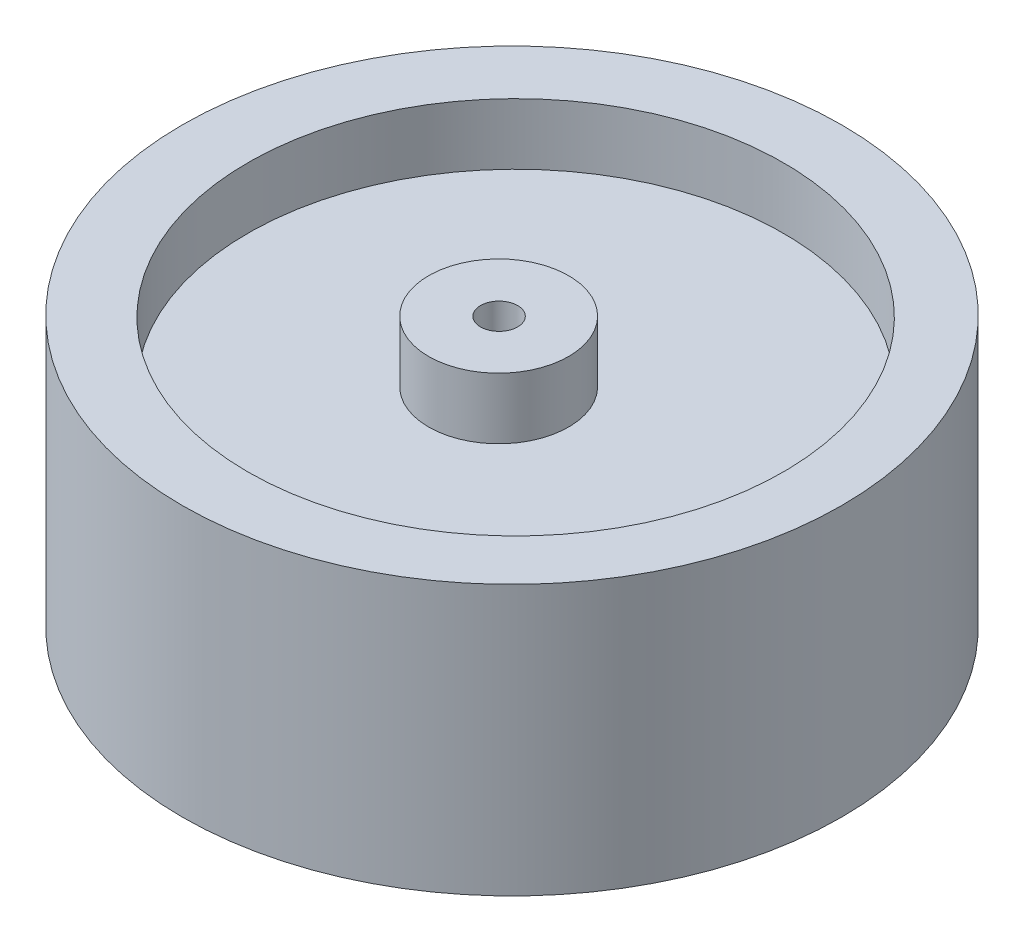
ISO-10303-21;
HEADER;
FILE_DESCRIPTION(('STEP AP214'),'2;1');
FILE_NAME('part.step','',(''),(''),'','','');
FILE_SCHEMA(('AUTOMOTIVE_DESIGN { 1 0 10303 214 1 1 1 1 }'));
ENDSEC;
DATA;
#1=APPLICATION_CONTEXT('core data for automotive mechanical design processes');
#2=APPLICATION_PROTOCOL_DEFINITION('international standard','automotive_design',2000,#1);
#3=PRODUCT_CONTEXT('',#1,'mechanical');
#4=PRODUCT('Part','Part','',(#3));
#5=PRODUCT_RELATED_PRODUCT_CATEGORY('part','',(#4));
#6=PRODUCT_DEFINITION_FORMATION('','',#4);
#7=PRODUCT_DEFINITION_CONTEXT('part definition',#1,'design');
#8=PRODUCT_DEFINITION('design','',#6,#7);
#9=PRODUCT_DEFINITION_SHAPE('','',#8);
#10=(LENGTH_UNIT() NAMED_UNIT(*) SI_UNIT(.MILLI.,.METRE.));
#11=(NAMED_UNIT(*) PLANE_ANGLE_UNIT() SI_UNIT($,.RADIAN.));
#12=(NAMED_UNIT(*) SI_UNIT($,.STERADIAN.) SOLID_ANGLE_UNIT());
#13=UNCERTAINTY_MEASURE_WITH_UNIT(LENGTH_MEASURE(1.E-05),#10,'distance_accuracy_value','');
#14=(GEOMETRIC_REPRESENTATION_CONTEXT(3) GLOBAL_UNCERTAINTY_ASSIGNED_CONTEXT((#13)) GLOBAL_UNIT_ASSIGNED_CONTEXT((#10,
#11,#12)) REPRESENTATION_CONTEXT('',''));
#15=CARTESIAN_POINT('',(0.,0.,0.));
#16=DIRECTION('',(0.,0.,1.));
#17=DIRECTION('',(1.,0.,0.));
#18=AXIS2_PLACEMENT_3D('',#15,#16,#17);
#19=CARTESIAN_POINT('',(3.18945115916419,26.6,0.));
#20=DIRECTION('',(0.,-1.,0.));
#21=DIRECTION('',(0.,0.,-1.));
#22=AXIS2_PLACEMENT_3D('',#19,#20,#21);
#23=CYLINDRICAL_SURFACE('',#22,32.5);
#24=CARTESIAN_POINT('',(3.18945115916419,26.6,0.));
#25=DIRECTION('',(0.,1.,0.));
#26=DIRECTION('',(0.,0.,1.));
#27=AXIS2_PLACEMENT_3D('',#24,#25,#26);
#28=CIRCLE('',#27,32.5);
#29=CARTESIAN_POINT('',(3.18945115916419,26.6,32.5));
#30=VERTEX_POINT('',#29);
#31=EDGE_CURVE('E51',#30,#30,#28,.T.);
#32=ORIENTED_EDGE('',*,*,#31,.F.);
#33=EDGE_LOOP('',(#32));
#34=FACE_BOUND('',#33,.T.);
#35=CARTESIAN_POINT('',(3.18945115916419,0.,0.));
#36=DIRECTION('',(0.,1.,0.));
#37=DIRECTION('',(0.,0.,1.));
#38=AXIS2_PLACEMENT_3D('',#35,#36,#37);
#39=CIRCLE('',#38,32.5);
#40=CARTESIAN_POINT('',(3.18945115916419,0.,32.5));
#41=VERTEX_POINT('',#40);
#42=EDGE_CURVE('E69',#41,#41,#39,.T.);
#43=ORIENTED_EDGE('',*,*,#42,.T.);
#44=EDGE_LOOP('',(#43));
#45=FACE_BOUND('',#44,.T.);
#46=ADVANCED_FACE('F37',(#34,#45),#23,.T.);
#47=CARTESIAN_POINT('',(3.18945115916419,26.6,0.));
#48=DIRECTION('',(0.,1.,0.));
#49=DIRECTION('',(0.,0.,1.));
#50=AXIS2_PLACEMENT_3D('',#47,#48,#49);
#51=PLANE('',#50);
#52=CARTESIAN_POINT('',(3.54785672823534,26.6,0.));
#53=DIRECTION('',(0.,1.,0.));
#54=DIRECTION('',(0.,0.,1.));
#55=AXIS2_PLACEMENT_3D('',#52,#53,#54);
#56=CIRCLE('',#55,26.4);
#57=CARTESIAN_POINT('',(3.54785672823534,26.6,26.4));
#58=VERTEX_POINT('',#57);
#59=EDGE_CURVE('E60',#58,#58,#56,.T.);
#60=ORIENTED_EDGE('',*,*,#59,.F.);
#61=EDGE_LOOP('',(#60));
#62=FACE_BOUND('',#61,.T.);
#63=ORIENTED_EDGE('',*,*,#31,.T.);
#64=EDGE_LOOP('',(#63));
#65=FACE_BOUND('',#64,.T.);
#66=ADVANCED_FACE('F84',(#62,#65),#51,.T.);
#67=CARTESIAN_POINT('',(3.18945115916419,0.,0.));
#68=DIRECTION('',(0.,1.,0.));
#69=DIRECTION('',(0.,0.,1.));
#70=AXIS2_PLACEMENT_3D('',#67,#68,#69);
#71=PLANE('',#70);
#72=CARTESIAN_POINT('',(2.92064698236082,0.,0.));
#73=DIRECTION('',(0.,-1.,0.));
#74=DIRECTION('',(0.,0.,-1.));
#75=AXIS2_PLACEMENT_3D('',#72,#73,#74);
#76=CIRCLE('',#75,25.9);
#77=CARTESIAN_POINT('',(2.92064698236082,0.,-25.9));
#78=VERTEX_POINT('',#77);
#79=EDGE_CURVE('E61',#78,#78,#76,.T.);
#80=ORIENTED_EDGE('',*,*,#79,.F.);
#81=EDGE_LOOP('',(#80));
#82=FACE_BOUND('',#81,.T.);
#83=ORIENTED_EDGE('',*,*,#42,.F.);
#84=EDGE_LOOP('',(#83));
#85=FACE_BOUND('',#84,.T.);
#86=ADVANCED_FACE('F81',(#82,#85),#71,.F.);
#87=CARTESIAN_POINT('',(3.54785672823534,20.574,0.));
#88=DIRECTION('',(0.,1.,0.));
#89=DIRECTION('',(0.,0.,1.));
#90=AXIS2_PLACEMENT_3D('',#87,#88,#89);
#91=CYLINDRICAL_SURFACE('',#90,26.4);
#92=CARTESIAN_POINT('',(3.54785672823534,20.574,0.));
#93=DIRECTION('',(0.,1.,0.));
#94=DIRECTION('',(0.,0.,1.));
#95=AXIS2_PLACEMENT_3D('',#92,#93,#94);
#96=CIRCLE('',#95,26.4);
#97=CARTESIAN_POINT('',(3.54785672823534,20.574,26.4));
#98=VERTEX_POINT('',#97);
#99=EDGE_CURVE('E65',#98,#98,#96,.T.);
#100=CARTESIAN_POINT('',(3.54785672823534,20.574,26.4));
#101=CARTESIAN_POINT('',(3.54785672823534,20.6367708333333,26.4));
#102=CARTESIAN_POINT('',(3.54785672823534,20.6995416666667,26.4));
#103=CARTESIAN_POINT('',(3.54785672823534,20.8250833333333,26.4));
#104=CARTESIAN_POINT('',(3.54785672823534,20.8878541666667,26.4));
#105=CARTESIAN_POINT('',(3.54785672823534,21.0133958333333,26.4));
#106=CARTESIAN_POINT('',(3.54785672823534,21.0761666666667,26.4));
#107=CARTESIAN_POINT('',(3.54785672823534,21.2017083333333,26.4));
#108=CARTESIAN_POINT('',(3.54785672823534,21.2644791666667,26.4));
#109=CARTESIAN_POINT('',(3.54785672823534,21.3900208333333,26.4));
#110=CARTESIAN_POINT('',(3.54785672823534,21.4527916666667,26.4));
#111=CARTESIAN_POINT('',(3.54785672823534,21.5783333333333,26.4));
#112=CARTESIAN_POINT('',(3.54785672823534,21.6411041666667,26.4));
#113=CARTESIAN_POINT('',(3.54785672823534,21.7666458333333,26.4));
#114=CARTESIAN_POINT('',(3.54785672823534,21.8294166666667,26.4));
#115=CARTESIAN_POINT('',(3.54785672823534,21.9549583333333,26.4));
#116=CARTESIAN_POINT('',(3.54785672823534,22.0177291666667,26.4));
#117=CARTESIAN_POINT('',(3.54785672823534,22.1432708333333,26.4));
#118=CARTESIAN_POINT('',(3.54785672823534,22.2060416666667,26.4));
#119=CARTESIAN_POINT('',(3.54785672823534,22.3315833333333,26.4));
#120=CARTESIAN_POINT('',(3.54785672823534,22.3943541666667,26.4));
#121=CARTESIAN_POINT('',(3.54785672823534,22.5198958333333,26.4));
#122=CARTESIAN_POINT('',(3.54785672823534,22.5826666666667,26.4));
#123=CARTESIAN_POINT('',(3.54785672823534,22.7082083333333,26.4));
#124=CARTESIAN_POINT('',(3.54785672823534,22.7709791666667,26.4));
#125=CARTESIAN_POINT('',(3.54785672823534,22.8965208333333,26.4));
#126=CARTESIAN_POINT('',(3.54785672823534,22.9592916666667,26.4));
#127=CARTESIAN_POINT('',(3.54785672823534,23.0848333333333,26.4));
#128=CARTESIAN_POINT('',(3.54785672823534,23.1476041666667,26.4));
#129=CARTESIAN_POINT('',(3.54785672823534,23.2731458333333,26.4));
#130=CARTESIAN_POINT('',(3.54785672823534,23.3359166666667,26.4));
#131=CARTESIAN_POINT('',(3.54785672823534,23.4614583333333,26.4));
#132=CARTESIAN_POINT('',(3.54785672823534,23.5242291666667,26.4));
#133=CARTESIAN_POINT('',(3.54785672823534,23.6497708333333,26.4));
#134=CARTESIAN_POINT('',(3.54785672823534,23.7125416666667,26.4));
#135=CARTESIAN_POINT('',(3.54785672823534,23.8380833333333,26.4));
#136=CARTESIAN_POINT('',(3.54785672823534,23.9008541666667,26.4));
#137=CARTESIAN_POINT('',(3.54785672823534,24.0263958333333,26.4));
#138=CARTESIAN_POINT('',(3.54785672823534,24.0891666666667,26.4));
#139=CARTESIAN_POINT('',(3.54785672823534,24.2147083333333,26.4));
#140=CARTESIAN_POINT('',(3.54785672823534,24.2774791666667,26.4));
#141=CARTESIAN_POINT('',(3.54785672823534,24.4030208333333,26.4));
#142=CARTESIAN_POINT('',(3.54785672823534,24.4657916666667,26.4));
#143=CARTESIAN_POINT('',(3.54785672823534,24.5913333333333,26.4));
#144=CARTESIAN_POINT('',(3.54785672823534,24.6541041666667,26.4));
#145=CARTESIAN_POINT('',(3.54785672823534,24.7796458333333,26.4));
#146=CARTESIAN_POINT('',(3.54785672823534,24.8424166666667,26.4));
#147=CARTESIAN_POINT('',(3.54785672823534,24.9679583333333,26.4));
#148=CARTESIAN_POINT('',(3.54785672823534,25.0307291666667,26.4));
#149=CARTESIAN_POINT('',(3.54785672823534,25.1562708333333,26.4));
#150=CARTESIAN_POINT('',(3.54785672823534,25.2190416666667,26.4));
#151=CARTESIAN_POINT('',(3.54785672823534,25.3445833333333,26.4));
#152=CARTESIAN_POINT('',(3.54785672823534,25.4073541666667,26.4));
#153=CARTESIAN_POINT('',(3.54785672823534,25.5328958333333,26.4));
#154=CARTESIAN_POINT('',(3.54785672823534,25.5956666666667,26.4));
#155=CARTESIAN_POINT('',(3.54785672823534,25.7212083333333,26.4));
#156=CARTESIAN_POINT('',(3.54785672823534,25.7839791666667,26.4));
#157=CARTESIAN_POINT('',(3.54785672823534,25.9095208333333,26.4));
#158=CARTESIAN_POINT('',(3.54785672823534,25.9722916666667,26.4));
#159=CARTESIAN_POINT('',(3.54785672823534,26.0978333333333,26.4));
#160=CARTESIAN_POINT('',(3.54785672823534,26.1606041666667,26.4));
#161=CARTESIAN_POINT('',(3.54785672823534,26.2861458333333,26.4));
#162=CARTESIAN_POINT('',(3.54785672823534,26.3489166666667,26.4));
#163=CARTESIAN_POINT('',(3.54785672823534,26.4744583333333,26.4));
#164=CARTESIAN_POINT('',(3.54785672823534,26.5372291666667,26.4));
#165=CARTESIAN_POINT('',(3.54785672823534,26.6,26.4));
#166=B_SPLINE_CURVE_WITH_KNOTS('',3,(#100,#101,#102,#103,#104,#105,#106,#107,#108,#109,#110,
#111,#112,#113,#114,#115,#116,#117,#118,#119,#120,#121,#122,#123,#124,#125,#126,#127,#128,#129,
#130,#131,#132,#133,#134,#135,#136,#137,#138,#139,#140,#141,#142,#143,#144,#145,#146,#147,#148,
#149,#150,#151,#152,#153,#154,#155,#156,#157,#158,#159,#160,#161,#162,#163,#164,#165),
.UNSPECIFIED.,.F.,.F.,(4,2,2,2,2,2,2,2,2,2,2,2,2,2,2,2,2,2,2,2,2,2,2,2,2,2,2,2,2,2,2,2,4),(0.,
0.188312499999999,0.376624999999998,0.564937499999998,0.753249999999997,0.941562499999996,
1.129875,1.31818749999999,1.5065,1.6948125,1.883125,2.0714375,2.25974999999999,2.44806249999999,
2.63637499999999,2.8246875,3.013,3.20131249999999,3.38962499999999,3.57793749999999,
3.76624999999999,3.95456249999999,4.14287499999999,4.33118749999999,4.51949999999999,
4.70781249999999,4.89612499999999,5.08443749999999,5.27274999999999,5.46106249999999,
5.64937499999999,5.83768749999999,6.02599999999999),.UNSPECIFIED.);
#167=EDGE_CURVE('BSEAM83',#98,#58,#166,.T.);
#168=ORIENTED_EDGE('',*,*,#99,.F.);
#169=ORIENTED_EDGE('',*,*,#59,.T.);
#170=ORIENTED_EDGE('',*,*,#167,.T.);
#171=ORIENTED_EDGE('',*,*,#167,.F.);
#172=EDGE_LOOP('',(#168,#170,#169,#171));
#173=FACE_BOUND('',#172,.T.);
#174=ADVANCED_FACE('F83',(#173),#91,.F.);
#175=CARTESIAN_POINT('',(3.54785672823534,20.574,0.));
#176=DIRECTION('',(0.,1.,0.));
#177=DIRECTION('',(0.,0.,1.));
#178=AXIS2_PLACEMENT_3D('',#175,#176,#177);
#179=PLANE('',#178);
#180=CARTESIAN_POINT('',(2.60515848770743,20.574,0.732268173699043));
#181=DIRECTION('',(0.,1.,0.));
#182=DIRECTION('',(0.,0.,1.));
#183=AXIS2_PLACEMENT_3D('',#180,#181,#182);
#184=CIRCLE('',#183,6.9);
#185=CARTESIAN_POINT('',(2.60515848770743,20.574,7.63226817369904));
#186=VERTEX_POINT('',#185);
#187=EDGE_CURVE('E10',#186,#186,#184,.T.);
#188=ORIENTED_EDGE('',*,*,#187,.F.);
#189=EDGE_LOOP('',(#188));
#190=FACE_BOUND('',#189,.T.);
#191=ORIENTED_EDGE('',*,*,#99,.T.);
#192=EDGE_LOOP('',(#191));
#193=FACE_BOUND('',#192,.T.);
#194=ADVANCED_FACE('F90',(#190,#193),#179,.T.);
#195=CARTESIAN_POINT('',(2.92064698236082,15.932,0.));
#196=DIRECTION('',(0.,-1.,0.));
#197=DIRECTION('',(0.,0.,-1.));
#198=AXIS2_PLACEMENT_3D('',#195,#196,#197);
#199=CYLINDRICAL_SURFACE('',#198,25.9);
#200=CARTESIAN_POINT('',(2.92064698236082,15.932,0.));
#201=DIRECTION('',(0.,-1.,0.));
#202=DIRECTION('',(0.,0.,-1.));
#203=AXIS2_PLACEMENT_3D('',#200,#201,#202);
#204=CIRCLE('',#203,25.9);
#205=CARTESIAN_POINT('',(2.92064698236082,15.932,-25.9));
#206=VERTEX_POINT('',#205);
#207=EDGE_CURVE('E56',#206,#206,#204,.T.);
#208=ORIENTED_EDGE('',*,*,#207,.F.);
#209=EDGE_LOOP('',(#208));
#210=FACE_BOUND('',#209,.T.);
#211=ORIENTED_EDGE('',*,*,#79,.T.);
#212=EDGE_LOOP('',(#211));
#213=FACE_BOUND('',#212,.T.);
#214=ADVANCED_FACE('F123',(#210,#213),#199,.F.);
#215=CARTESIAN_POINT('',(2.92064698236082,15.932,0.));
#216=DIRECTION('',(0.,-1.,0.));
#217=DIRECTION('',(0.,0.,-1.));
#218=AXIS2_PLACEMENT_3D('',#215,#216,#217);
#219=PLANE('',#218);
#220=CARTESIAN_POINT('',(2.60515848770743,15.932,0.732268173699043));
#221=DIRECTION('',(0.,-1.,0.));
#222=DIRECTION('',(0.,0.,-1.));
#223=AXIS2_PLACEMENT_3D('',#220,#221,#222);
#224=CIRCLE('',#223,6.9);
#225=CARTESIAN_POINT('',(2.60515848770743,15.932,7.63226817369904));
#226=VERTEX_POINT('',#225);
#227=EDGE_CURVE('E45',#226,#226,#224,.T.);
#228=ORIENTED_EDGE('',*,*,#227,.F.);
#229=EDGE_LOOP('',(#228));
#230=FACE_BOUND('',#229,.T.);
#231=ORIENTED_EDGE('',*,*,#207,.T.);
#232=EDGE_LOOP('',(#231));
#233=FACE_BOUND('',#232,.T.);
#234=ADVANCED_FACE('F128',(#230,#233),#219,.T.);
#235=CARTESIAN_POINT('',(2.60515848770743,-0.254000000000004,0.732268173699043));
#236=DIRECTION('',(0.,1.,0.));
#237=DIRECTION('',(0.,0.,1.));
#238=AXIS2_PLACEMENT_3D('',#235,#236,#237);
#239=PLANE('',#238);
#240=CARTESIAN_POINT('',(2.64141744815092,-0.254000000000004,0.724168536309739));
#241=DIRECTION('',(0.,1.,0.));
#242=DIRECTION('',(0.,0.,1.));
#243=AXIS2_PLACEMENT_3D('',#240,#241,#242);
#244=CIRCLE('',#243,1.83);
#245=CARTESIAN_POINT('',(2.64141744815092,-0.254000000000004,2.55416853630974));
#246=VERTEX_POINT('',#245);
#247=EDGE_CURVE('E202',#246,#246,#244,.F.);
#248=ORIENTED_EDGE('',*,*,#247,.F.);
#249=EDGE_LOOP('',(#248));
#250=FACE_BOUND('',#249,.T.);
#251=CARTESIAN_POINT('',(2.60515848770743,-0.254000000000004,0.732268173699043));
#252=DIRECTION('',(0.,1.,0.));
#253=DIRECTION('',(0.,0.,1.));
#254=AXIS2_PLACEMENT_3D('',#251,#252,#253);
#255=CIRCLE('',#254,6.9);
#256=CARTESIAN_POINT('',(2.60515848770743,-0.254000000000004,7.63226817369904));
#257=VERTEX_POINT('',#256);
#258=EDGE_CURVE('E54',#257,#257,#255,.T.);
#259=ORIENTED_EDGE('',*,*,#258,.F.);
#260=EDGE_LOOP('',(#259));
#261=FACE_BOUND('',#260,.T.);
#262=ADVANCED_FACE('F145',(#250,#261),#239,.F.);
#263=CARTESIAN_POINT('',(2.60515848770743,-0.254000000000004,0.732268173699043));
#264=DIRECTION('',(0.,1.,0.));
#265=DIRECTION('',(0.,0.,1.));
#266=AXIS2_PLACEMENT_3D('',#263,#264,#265);
#267=CYLINDRICAL_SURFACE('',#266,6.9);
#268=CARTESIAN_POINT('',(2.60515848770743,15.932,7.63226817369904));
#269=CARTESIAN_POINT('',(2.60515848770743,15.7633958333333,7.63226817369904));
#270=CARTESIAN_POINT('',(2.60515848770743,15.5947916666667,7.63226817369904));
#271=CARTESIAN_POINT('',(2.60515848770743,15.2575833333333,7.63226817369904));
#272=CARTESIAN_POINT('',(2.60515848770743,15.0889791666667,7.63226817369904));
#273=CARTESIAN_POINT('',(2.60515848770743,14.7517708333333,7.63226817369904));
#274=CARTESIAN_POINT('',(2.60515848770743,14.5831666666667,7.63226817369904));
#275=CARTESIAN_POINT('',(2.60515848770743,14.2459583333333,7.63226817369904));
#276=CARTESIAN_POINT('',(2.60515848770743,14.0773541666667,7.63226817369904));
#277=CARTESIAN_POINT('',(2.60515848770743,13.7401458333333,7.63226817369904));
#278=CARTESIAN_POINT('',(2.60515848770743,13.5715416666667,7.63226817369904));
#279=CARTESIAN_POINT('',(2.60515848770743,13.2343333333333,7.63226817369904));
#280=CARTESIAN_POINT('',(2.60515848770743,13.0657291666667,7.63226817369904));
#281=CARTESIAN_POINT('',(2.60515848770743,12.7285208333333,7.63226817369904));
#282=CARTESIAN_POINT('',(2.60515848770743,12.5599166666667,7.63226817369904));
#283=CARTESIAN_POINT('',(2.60515848770743,12.2227083333333,7.63226817369904));
#284=CARTESIAN_POINT('',(2.60515848770743,12.0541041666667,7.63226817369904));
#285=CARTESIAN_POINT('',(2.60515848770743,11.7168958333333,7.63226817369904));
#286=CARTESIAN_POINT('',(2.60515848770743,11.5482916666667,7.63226817369904));
#287=CARTESIAN_POINT('',(2.60515848770743,11.2110833333333,7.63226817369904));
#288=CARTESIAN_POINT('',(2.60515848770743,11.0424791666667,7.63226817369904));
#289=CARTESIAN_POINT('',(2.60515848770743,10.7052708333333,7.63226817369904));
#290=CARTESIAN_POINT('',(2.60515848770743,10.5366666666667,7.63226817369904));
#291=CARTESIAN_POINT('',(2.60515848770743,10.1994583333333,7.63226817369904));
#292=CARTESIAN_POINT('',(2.60515848770743,10.0308541666667,7.63226817369904));
#293=CARTESIAN_POINT('',(2.60515848770743,9.69364583333333,7.63226817369904));
#294=CARTESIAN_POINT('',(2.60515848770743,9.52504166666666,7.63226817369904));
#295=CARTESIAN_POINT('',(2.60515848770743,9.18783333333333,7.63226817369904));
#296=CARTESIAN_POINT('',(2.60515848770743,9.01922916666666,7.63226817369904));
#297=CARTESIAN_POINT('',(2.60515848770743,8.68202083333333,7.63226817369904));
#298=CARTESIAN_POINT('',(2.60515848770743,8.51341666666666,7.63226817369904));
#299=CARTESIAN_POINT('',(2.60515848770743,8.17620833333333,7.63226817369904));
#300=CARTESIAN_POINT('',(2.60515848770743,8.00760416666667,7.63226817369904));
#301=CARTESIAN_POINT('',(2.60515848770743,7.67039583333333,7.63226817369904));
#302=CARTESIAN_POINT('',(2.60515848770743,7.50179166666666,7.63226817369904));
#303=CARTESIAN_POINT('',(2.60515848770743,7.16458333333333,7.63226817369904));
#304=CARTESIAN_POINT('',(2.60515848770743,6.99597916666666,7.63226817369904));
#305=CARTESIAN_POINT('',(2.60515848770743,6.65877083333333,7.63226817369904));
#306=CARTESIAN_POINT('',(2.60515848770743,6.49016666666667,7.63226817369904));
#307=CARTESIAN_POINT('',(2.60515848770743,6.15295833333333,7.63226817369904));
#308=CARTESIAN_POINT('',(2.60515848770743,5.98435416666666,7.63226817369904));
#309=CARTESIAN_POINT('',(2.60515848770743,5.64714583333333,7.63226817369904));
#310=CARTESIAN_POINT('',(2.60515848770743,5.47854166666666,7.63226817369904));
#311=CARTESIAN_POINT('',(2.60515848770743,5.14133333333333,7.63226817369904));
#312=CARTESIAN_POINT('',(2.60515848770743,4.97272916666666,7.63226817369904));
#313=CARTESIAN_POINT('',(2.60515848770743,4.63552083333333,7.63226817369904));
#314=CARTESIAN_POINT('',(2.60515848770743,4.46691666666666,7.63226817369904));
#315=CARTESIAN_POINT('',(2.60515848770743,4.12970833333333,7.63226817369904));
#316=CARTESIAN_POINT('',(2.60515848770743,3.96110416666666,7.63226817369904));
#317=CARTESIAN_POINT('',(2.60515848770743,3.62389583333333,7.63226817369904));
#318=CARTESIAN_POINT('',(2.60515848770743,3.45529166666666,7.63226817369904));
#319=CARTESIAN_POINT('',(2.60515848770743,3.11808333333333,7.63226817369904));
#320=CARTESIAN_POINT('',(2.60515848770743,2.94947916666666,7.63226817369904));
#321=CARTESIAN_POINT('',(2.60515848770743,2.61227083333333,7.63226817369904));
#322=CARTESIAN_POINT('',(2.60515848770743,2.44366666666666,7.63226817369904));
#323=CARTESIAN_POINT('',(2.60515848770743,2.10645833333333,7.63226817369904));
#324=CARTESIAN_POINT('',(2.60515848770743,1.93785416666666,7.63226817369904));
#325=CARTESIAN_POINT('',(2.60515848770743,1.60064583333333,7.63226817369904));
#326=CARTESIAN_POINT('',(2.60515848770743,1.43204166666666,7.63226817369904));
#327=CARTESIAN_POINT('',(2.60515848770743,1.09483333333333,7.63226817369904));
#328=CARTESIAN_POINT('',(2.60515848770743,0.926229166666662,7.63226817369904));
#329=CARTESIAN_POINT('',(2.60515848770743,0.58902083333333,7.63226817369904));
#330=CARTESIAN_POINT('',(2.60515848770743,0.420416666666663,7.63226817369904));
#331=CARTESIAN_POINT('',(2.60515848770743,0.0832083333333297,7.63226817369904));
#332=CARTESIAN_POINT('',(2.60515848770743,-0.0853958333333373,7.63226817369904));
#333=CARTESIAN_POINT('',(2.60515848770743,-0.254000000000004,7.63226817369904));
#334=B_SPLINE_CURVE_WITH_KNOTS('',3,(#268,#269,#270,#271,#272,#273,#274,#275,#276,#277,#278,
#279,#280,#281,#282,#283,#284,#285,#286,#287,#288,#289,#290,#291,#292,#293,#294,#295,#296,#297,
#298,#299,#300,#301,#302,#303,#304,#305,#306,#307,#308,#309,#310,#311,#312,#313,#314,#315,#316,
#317,#318,#319,#320,#321,#322,#323,#324,#325,#326,#327,#328,#329,#330,#331,#332,#333),
.UNSPECIFIED.,.F.,.F.,(4,2,2,2,2,2,2,2,2,2,2,2,2,2,2,2,2,2,2,2,2,2,2,2,2,2,2,2,2,2,2,2,4),(0.,
0.505812500000001,1.011625,1.5174375,2.02325,2.5290625,3.034875,3.5406875,4.0465,4.5523125,
5.058125,5.5639375,6.06975,6.5755625,7.081375,7.5871875,8.093,8.5988125,9.104625,9.6104375,
10.11625,10.6220625,11.127875,11.6336875,12.1395,12.6453125,13.151125,13.6569375,14.16275,
14.6685625,15.174375,15.6801875,16.186),.UNSPECIFIED.);
#335=EDGE_CURVE('BSEAM153',#226,#257,#334,.T.);
#336=ORIENTED_EDGE('',*,*,#227,.T.);
#337=ORIENTED_EDGE('',*,*,#258,.T.);
#338=ORIENTED_EDGE('',*,*,#335,.T.);
#339=ORIENTED_EDGE('',*,*,#335,.F.);
#340=EDGE_LOOP('',(#336,#338,#337,#339));
#341=FACE_BOUND('',#340,.T.);
#342=ADVANCED_FACE('F153',(#341),#267,.T.);
#343=CARTESIAN_POINT('',(2.60515848770743,26.6,0.732268173699043));
#344=DIRECTION('',(0.,1.,0.));
#345=DIRECTION('',(0.,0.,1.));
#346=AXIS2_PLACEMENT_3D('',#343,#344,#345);
#347=CIRCLE('',#346,6.9);
#348=CARTESIAN_POINT('',(2.60515848770743,26.6,7.63226817369904));
#349=VERTEX_POINT('',#348);
#350=EDGE_CURVE('E204',#349,#349,#347,.T.);
#351=CARTESIAN_POINT('',(2.60515848770743,20.574,7.63226817369904));
#352=CARTESIAN_POINT('',(2.60515848770743,20.6367708333333,7.63226817369904));
#353=CARTESIAN_POINT('',(2.60515848770743,20.6995416666667,7.63226817369904));
#354=CARTESIAN_POINT('',(2.60515848770743,20.8250833333333,7.63226817369904));
#355=CARTESIAN_POINT('',(2.60515848770743,20.8878541666667,7.63226817369904));
#356=CARTESIAN_POINT('',(2.60515848770743,21.0133958333333,7.63226817369904));
#357=CARTESIAN_POINT('',(2.60515848770743,21.0761666666667,7.63226817369904));
#358=CARTESIAN_POINT('',(2.60515848770743,21.2017083333333,7.63226817369904));
#359=CARTESIAN_POINT('',(2.60515848770743,21.2644791666667,7.63226817369904));
#360=CARTESIAN_POINT('',(2.60515848770743,21.3900208333333,7.63226817369904));
#361=CARTESIAN_POINT('',(2.60515848770743,21.4527916666667,7.63226817369904));
#362=CARTESIAN_POINT('',(2.60515848770743,21.5783333333333,7.63226817369904));
#363=CARTESIAN_POINT('',(2.60515848770743,21.6411041666667,7.63226817369904));
#364=CARTESIAN_POINT('',(2.60515848770743,21.7666458333333,7.63226817369904));
#365=CARTESIAN_POINT('',(2.60515848770743,21.8294166666667,7.63226817369904));
#366=CARTESIAN_POINT('',(2.60515848770743,21.9549583333333,7.63226817369904));
#367=CARTESIAN_POINT('',(2.60515848770743,22.0177291666667,7.63226817369904));
#368=CARTESIAN_POINT('',(2.60515848770743,22.1432708333333,7.63226817369904));
#369=CARTESIAN_POINT('',(2.60515848770743,22.2060416666667,7.63226817369904));
#370=CARTESIAN_POINT('',(2.60515848770743,22.3315833333333,7.63226817369904));
#371=CARTESIAN_POINT('',(2.60515848770743,22.3943541666667,7.63226817369904));
#372=CARTESIAN_POINT('',(2.60515848770743,22.5198958333333,7.63226817369904));
#373=CARTESIAN_POINT('',(2.60515848770743,22.5826666666667,7.63226817369904));
#374=CARTESIAN_POINT('',(2.60515848770743,22.7082083333333,7.63226817369904));
#375=CARTESIAN_POINT('',(2.60515848770743,22.7709791666667,7.63226817369904));
#376=CARTESIAN_POINT('',(2.60515848770743,22.8965208333333,7.63226817369904));
#377=CARTESIAN_POINT('',(2.60515848770743,22.9592916666667,7.63226817369904));
#378=CARTESIAN_POINT('',(2.60515848770743,23.0848333333333,7.63226817369904));
#379=CARTESIAN_POINT('',(2.60515848770743,23.1476041666667,7.63226817369904));
#380=CARTESIAN_POINT('',(2.60515848770743,23.2731458333333,7.63226817369904));
#381=CARTESIAN_POINT('',(2.60515848770743,23.3359166666667,7.63226817369904));
#382=CARTESIAN_POINT('',(2.60515848770743,23.4614583333333,7.63226817369904));
#383=CARTESIAN_POINT('',(2.60515848770743,23.5242291666667,7.63226817369904));
#384=CARTESIAN_POINT('',(2.60515848770743,23.6497708333333,7.63226817369904));
#385=CARTESIAN_POINT('',(2.60515848770743,23.7125416666667,7.63226817369904));
#386=CARTESIAN_POINT('',(2.60515848770743,23.8380833333333,7.63226817369904));
#387=CARTESIAN_POINT('',(2.60515848770743,23.9008541666667,7.63226817369904));
#388=CARTESIAN_POINT('',(2.60515848770743,24.0263958333333,7.63226817369904));
#389=CARTESIAN_POINT('',(2.60515848770743,24.0891666666667,7.63226817369904));
#390=CARTESIAN_POINT('',(2.60515848770743,24.2147083333333,7.63226817369904));
#391=CARTESIAN_POINT('',(2.60515848770743,24.2774791666667,7.63226817369904));
#392=CARTESIAN_POINT('',(2.60515848770743,24.4030208333333,7.63226817369904));
#393=CARTESIAN_POINT('',(2.60515848770743,24.4657916666667,7.63226817369904));
#394=CARTESIAN_POINT('',(2.60515848770743,24.5913333333333,7.63226817369904));
#395=CARTESIAN_POINT('',(2.60515848770743,24.6541041666667,7.63226817369904));
#396=CARTESIAN_POINT('',(2.60515848770743,24.7796458333333,7.63226817369904));
#397=CARTESIAN_POINT('',(2.60515848770743,24.8424166666667,7.63226817369904));
#398=CARTESIAN_POINT('',(2.60515848770743,24.9679583333333,7.63226817369904));
#399=CARTESIAN_POINT('',(2.60515848770743,25.0307291666667,7.63226817369904));
#400=CARTESIAN_POINT('',(2.60515848770743,25.1562708333333,7.63226817369904));
#401=CARTESIAN_POINT('',(2.60515848770743,25.2190416666667,7.63226817369904));
#402=CARTESIAN_POINT('',(2.60515848770743,25.3445833333333,7.63226817369904));
#403=CARTESIAN_POINT('',(2.60515848770743,25.4073541666667,7.63226817369904));
#404=CARTESIAN_POINT('',(2.60515848770743,25.5328958333333,7.63226817369904));
#405=CARTESIAN_POINT('',(2.60515848770743,25.5956666666667,7.63226817369904));
#406=CARTESIAN_POINT('',(2.60515848770743,25.7212083333333,7.63226817369904));
#407=CARTESIAN_POINT('',(2.60515848770743,25.7839791666667,7.63226817369904));
#408=CARTESIAN_POINT('',(2.60515848770743,25.9095208333333,7.63226817369904));
#409=CARTESIAN_POINT('',(2.60515848770743,25.9722916666667,7.63226817369904));
#410=CARTESIAN_POINT('',(2.60515848770743,26.0978333333333,7.63226817369904));
#411=CARTESIAN_POINT('',(2.60515848770743,26.1606041666667,7.63226817369904));
#412=CARTESIAN_POINT('',(2.60515848770743,26.2861458333333,7.63226817369904));
#413=CARTESIAN_POINT('',(2.60515848770743,26.3489166666667,7.63226817369904));
#414=CARTESIAN_POINT('',(2.60515848770743,26.4744583333333,7.63226817369904));
#415=CARTESIAN_POINT('',(2.60515848770743,26.5372291666667,7.63226817369904));
#416=CARTESIAN_POINT('',(2.60515848770743,26.6,7.63226817369904));
#417=B_SPLINE_CURVE_WITH_KNOTS('',3,(#351,#352,#353,#354,#355,#356,#357,#358,#359,#360,#361,
#362,#363,#364,#365,#366,#367,#368,#369,#370,#371,#372,#373,#374,#375,#376,#377,#378,#379,#380,
#381,#382,#383,#384,#385,#386,#387,#388,#389,#390,#391,#392,#393,#394,#395,#396,#397,#398,#399,
#400,#401,#402,#403,#404,#405,#406,#407,#408,#409,#410,#411,#412,#413,#414,#415,#416),
.UNSPECIFIED.,.F.,.F.,(4,2,2,2,2,2,2,2,2,2,2,2,2,2,2,2,2,2,2,2,2,2,2,2,2,2,2,2,2,2,2,2,4),(0.,
0.188312499999999,0.376624999999998,0.564937499999998,0.753249999999997,0.9415625,1.129875,
1.3181875,1.5065,1.6948125,1.883125,2.0714375,2.25975,2.4480625,2.636375,2.8246875,3.013,
3.20131249999999,3.38962499999999,3.57793749999999,3.76624999999999,3.95456249999999,
4.14287499999999,4.33118749999999,4.51949999999999,4.70781249999999,4.89612499999999,
5.08443749999999,5.27274999999999,5.46106249999999,5.64937499999999,5.83768749999999,
6.02599999999999),.UNSPECIFIED.);
#418=EDGE_CURVE('BSEAM158',#186,#349,#417,.T.);
#419=ORIENTED_EDGE('',*,*,#187,.T.);
#420=ORIENTED_EDGE('',*,*,#350,.F.);
#421=ORIENTED_EDGE('',*,*,#418,.T.);
#422=ORIENTED_EDGE('',*,*,#418,.F.);
#423=EDGE_LOOP('',(#419,#421,#420,#422));
#424=FACE_BOUND('',#423,.T.);
#425=ADVANCED_FACE('F158',(#424),#267,.T.);
#426=CARTESIAN_POINT('',(2.60515848770743,26.6,0.732268173699043));
#427=DIRECTION('',(0.,1.,0.));
#428=DIRECTION('',(0.,0.,1.));
#429=AXIS2_PLACEMENT_3D('',#426,#427,#428);
#430=PLANE('',#429);
#431=CARTESIAN_POINT('',(2.64141744815092,26.6,0.724168536309739));
#432=DIRECTION('',(0.,1.,0.));
#433=DIRECTION('',(0.,0.,1.));
#434=AXIS2_PLACEMENT_3D('',#431,#432,#433);
#435=CIRCLE('',#434,1.83);
#436=CARTESIAN_POINT('',(2.64141744815092,26.6,2.55416853630974));
#437=VERTEX_POINT('',#436);
#438=EDGE_CURVE('E40',#437,#437,#435,.F.);
#439=ORIENTED_EDGE('',*,*,#438,.T.);
#440=EDGE_LOOP('',(#439));
#441=FACE_BOUND('',#440,.T.);
#442=ORIENTED_EDGE('',*,*,#350,.T.);
#443=EDGE_LOOP('',(#442));
#444=FACE_BOUND('',#443,.T.);
#445=ADVANCED_FACE('F168',(#441,#444),#430,.T.);
#446=CARTESIAN_POINT('',(2.64141744815092,40.062,0.724168536309739));
#447=DIRECTION('',(0.,-1.,0.));
#448=DIRECTION('',(0.,0.,-1.));
#449=AXIS2_PLACEMENT_3D('',#446,#447,#448);
#450=CYLINDRICAL_SURFACE('',#449,1.83);
#451=ORIENTED_EDGE('',*,*,#438,.F.);
#452=EDGE_LOOP('',(#451));
#453=FACE_BOUND('',#452,.T.);
#454=ORIENTED_EDGE('',*,*,#247,.T.);
#455=EDGE_LOOP('',(#454));
#456=FACE_BOUND('',#455,.T.);
#457=ADVANCED_FACE('F183',(#453,#456),#450,.F.);
#458=CLOSED_SHELL('',(#46,#66,#86,#174,#194,#214,#234,#262,#342,#425,#445,#457));
#459=MANIFOLD_SOLID_BREP('B2',#458);
#460=ADVANCED_BREP_SHAPE_REPRESENTATION('',(#18,#459),#14);
#461=SHAPE_DEFINITION_REPRESENTATION(#9,#460);
ENDSEC;
END-ISO-10303-21;
